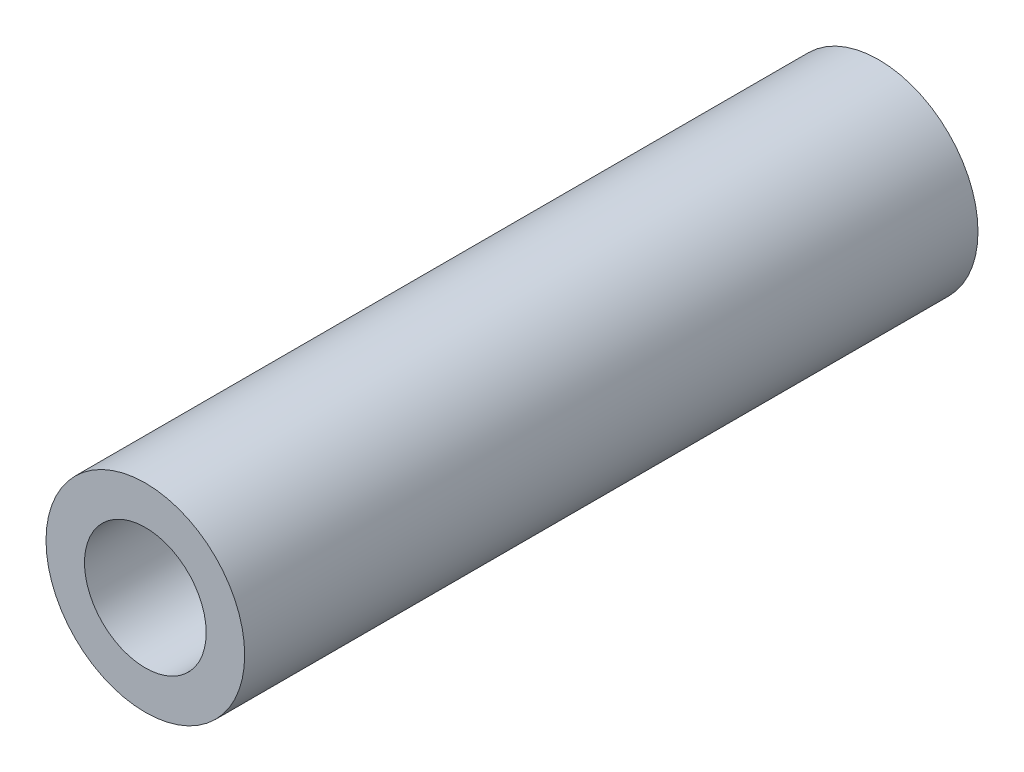
ISO-10303-21;
HEADER;
FILE_DESCRIPTION(('STEP AP214'),'2;1');
FILE_NAME('part.step','',(''),(''),'','','');
FILE_SCHEMA(('AUTOMOTIVE_DESIGN { 1 0 10303 214 1 1 1 1 }'));
ENDSEC;
DATA;
#1=APPLICATION_CONTEXT('core data for automotive mechanical design processes');
#2=APPLICATION_PROTOCOL_DEFINITION('international standard','automotive_design',2000,#1);
#3=PRODUCT_CONTEXT('',#1,'mechanical');
#4=PRODUCT('Part','Part','',(#3));
#5=PRODUCT_RELATED_PRODUCT_CATEGORY('part','',(#4));
#6=PRODUCT_DEFINITION_FORMATION('','',#4);
#7=PRODUCT_DEFINITION_CONTEXT('part definition',#1,'design');
#8=PRODUCT_DEFINITION('design','',#6,#7);
#9=PRODUCT_DEFINITION_SHAPE('','',#8);
#10=(LENGTH_UNIT() NAMED_UNIT(*) SI_UNIT(.MILLI.,.METRE.));
#11=(NAMED_UNIT(*) PLANE_ANGLE_UNIT() SI_UNIT($,.RADIAN.));
#12=(NAMED_UNIT(*) SI_UNIT($,.STERADIAN.) SOLID_ANGLE_UNIT());
#13=UNCERTAINTY_MEASURE_WITH_UNIT(LENGTH_MEASURE(1.E-05),#10,'distance_accuracy_value','');
#14=(GEOMETRIC_REPRESENTATION_CONTEXT(3) GLOBAL_UNCERTAINTY_ASSIGNED_CONTEXT((#13)) GLOBAL_UNIT_ASSIGNED_CONTEXT((#10,
#11,#12)) REPRESENTATION_CONTEXT('',''));
#15=CARTESIAN_POINT('',(0.,0.,0.));
#16=DIRECTION('',(0.,0.,1.));
#17=DIRECTION('',(1.,0.,0.));
#18=AXIS2_PLACEMENT_3D('',#15,#16,#17);
#19=CARTESIAN_POINT('',(0.,0.,15.));
#20=DIRECTION('',(0.,0.,1.));
#21=DIRECTION('',(1.,0.,0.));
#22=AXIS2_PLACEMENT_3D('',#19,#20,#21);
#23=PLANE('',#22);
#24=CARTESIAN_POINT('',(0.,0.,15.));
#25=DIRECTION('',(0.,0.,1.));
#26=DIRECTION('',(1.,0.,0.));
#27=AXIS2_PLACEMENT_3D('',#24,#25,#26);
#28=CIRCLE('',#27,4.064);
#29=CARTESIAN_POINT('',(4.064,0.,15.));
#30=VERTEX_POINT('',#29);
#31=EDGE_CURVE('E10',#30,#30,#28,.T.);
#32=ORIENTED_EDGE('',*,*,#31,.T.);
#33=EDGE_LOOP('',(#32));
#34=FACE_BOUND('',#33,.T.);
#35=CARTESIAN_POINT('',(0.,0.,15.));
#36=DIRECTION('',(0.,0.,1.));
#37=DIRECTION('',(1.,0.,0.));
#38=AXIS2_PLACEMENT_3D('',#35,#36,#37);
#39=CIRCLE('',#38,2.4892);
#40=CARTESIAN_POINT('',(2.4892,0.,15.));
#41=VERTEX_POINT('',#40);
#42=EDGE_CURVE('E46',#41,#41,#39,.T.);
#43=ORIENTED_EDGE('',*,*,#42,.F.);
#44=EDGE_LOOP('',(#43));
#45=FACE_BOUND('',#44,.T.);
#46=ADVANCED_FACE('F35',(#34,#45),#23,.T.);
#47=CARTESIAN_POINT('',(0.,0.,-15.));
#48=DIRECTION('',(0.,0.,1.));
#49=DIRECTION('',(1.,0.,0.));
#50=AXIS2_PLACEMENT_3D('',#47,#48,#49);
#51=PLANE('',#50);
#52=CARTESIAN_POINT('',(0.,0.,-15.));
#53=DIRECTION('',(0.,0.,1.));
#54=DIRECTION('',(1.,0.,0.));
#55=AXIS2_PLACEMENT_3D('',#52,#53,#54);
#56=CIRCLE('',#55,4.064);
#57=CARTESIAN_POINT('',(4.064,0.,-15.));
#58=VERTEX_POINT('',#57);
#59=EDGE_CURVE('E39',#58,#58,#56,.T.);
#60=ORIENTED_EDGE('',*,*,#59,.F.);
#61=EDGE_LOOP('',(#60));
#62=FACE_BOUND('',#61,.T.);
#63=CARTESIAN_POINT('',(0.,0.,-15.));
#64=DIRECTION('',(0.,0.,1.));
#65=DIRECTION('',(1.,0.,0.));
#66=AXIS2_PLACEMENT_3D('',#63,#64,#65);
#67=CIRCLE('',#66,2.4892);
#68=CARTESIAN_POINT('',(2.4892,0.,-15.));
#69=VERTEX_POINT('',#68);
#70=EDGE_CURVE('E48',#69,#69,#67,.T.);
#71=ORIENTED_EDGE('',*,*,#70,.T.);
#72=EDGE_LOOP('',(#71));
#73=FACE_BOUND('',#72,.T.);
#74=ADVANCED_FACE('F58',(#62,#73),#51,.F.);
#75=CARTESIAN_POINT('',(0.,0.,15.));
#76=DIRECTION('',(0.,0.,-1.));
#77=DIRECTION('',(-1.,0.,0.));
#78=AXIS2_PLACEMENT_3D('',#75,#76,#77);
#79=CYLINDRICAL_SURFACE('',#78,4.064);
#80=ORIENTED_EDGE('',*,*,#31,.F.);
#81=EDGE_LOOP('',(#80));
#82=FACE_BOUND('',#81,.T.);
#83=ORIENTED_EDGE('',*,*,#59,.T.);
#84=EDGE_LOOP('',(#83));
#85=FACE_BOUND('',#84,.T.);
#86=ADVANCED_FACE('F37',(#82,#85),#79,.T.);
#87=CARTESIAN_POINT('',(0.,0.,15.));
#88=DIRECTION('',(0.,0.,-1.));
#89=DIRECTION('',(-1.,0.,0.));
#90=AXIS2_PLACEMENT_3D('',#87,#88,#89);
#91=CYLINDRICAL_SURFACE('',#90,2.4892);
#92=ORIENTED_EDGE('',*,*,#42,.T.);
#93=EDGE_LOOP('',(#92));
#94=FACE_BOUND('',#93,.T.);
#95=ORIENTED_EDGE('',*,*,#70,.F.);
#96=EDGE_LOOP('',(#95));
#97=FACE_BOUND('',#96,.T.);
#98=ADVANCED_FACE('F54',(#94,#97),#91,.F.);
#99=CLOSED_SHELL('',(#46,#74,#86,#98));
#100=MANIFOLD_SOLID_BREP('B2',#99);
#101=ADVANCED_BREP_SHAPE_REPRESENTATION('',(#18,#100),#14);
#102=SHAPE_DEFINITION_REPRESENTATION(#9,#101);
ENDSEC;
END-ISO-10303-21;
